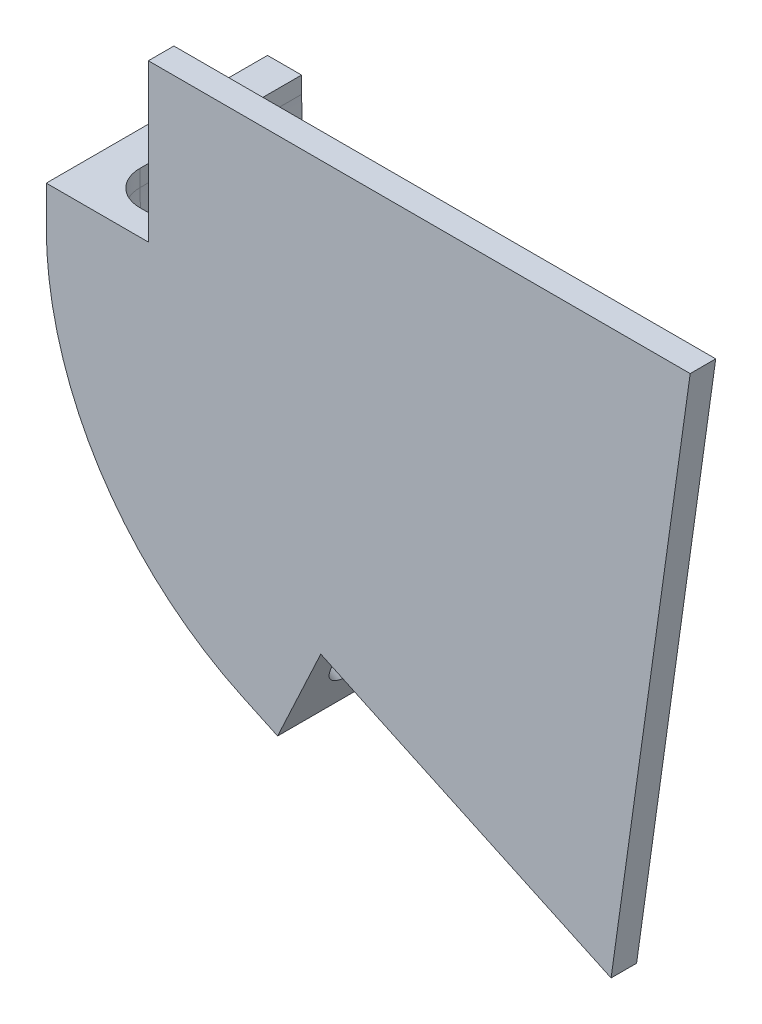
ISO-10303-21;
HEADER;
FILE_DESCRIPTION(('STEP AP214'),'2;1');
FILE_NAME('part.step','',(''),(''),'','','');
FILE_SCHEMA(('AUTOMOTIVE_DESIGN { 1 0 10303 214 1 1 1 1 }'));
ENDSEC;
DATA;
#1=APPLICATION_CONTEXT('core data for automotive mechanical design processes');
#2=APPLICATION_PROTOCOL_DEFINITION('international standard','automotive_design',2000,#1);
#3=PRODUCT_CONTEXT('',#1,'mechanical');
#4=PRODUCT('Part','Part','',(#3));
#5=PRODUCT_RELATED_PRODUCT_CATEGORY('part','',(#4));
#6=PRODUCT_DEFINITION_FORMATION('','',#4);
#7=PRODUCT_DEFINITION_CONTEXT('part definition',#1,'design');
#8=PRODUCT_DEFINITION('design','',#6,#7);
#9=PRODUCT_DEFINITION_SHAPE('','',#8);
#10=(LENGTH_UNIT() NAMED_UNIT(*) SI_UNIT(.MILLI.,.METRE.));
#11=(NAMED_UNIT(*) PLANE_ANGLE_UNIT() SI_UNIT($,.RADIAN.));
#12=(NAMED_UNIT(*) SI_UNIT($,.STERADIAN.) SOLID_ANGLE_UNIT());
#13=UNCERTAINTY_MEASURE_WITH_UNIT(LENGTH_MEASURE(1.E-05),#10,'distance_accuracy_value','');
#14=(GEOMETRIC_REPRESENTATION_CONTEXT(3) GLOBAL_UNCERTAINTY_ASSIGNED_CONTEXT((#13)) GLOBAL_UNIT_ASSIGNED_CONTEXT((#10,
#11,#12)) REPRESENTATION_CONTEXT('',''));
#15=CARTESIAN_POINT('',(0.,0.,0.));
#16=DIRECTION('',(0.,0.,1.));
#17=DIRECTION('',(1.,0.,0.));
#18=AXIS2_PLACEMENT_3D('',#15,#16,#17);
#19=CARTESIAN_POINT('',(-18.0763999587272,-9.66698227820091,24.5));
#20=DIRECTION('',(1.,0.,0.));
#21=DIRECTION('',(0.,1.,0.));
#22=AXIS2_PLACEMENT_3D('',#19,#20,#21);
#23=PLANE('',#22);
#24=DIRECTION('',(0.,-1.,0.));
#25=VECTOR('',#24,1.);
#26=CARTESIAN_POINT('',(-18.0763999587272,-9.66698227820091,26.));
#27=LINE('',#26,#25);
#28=CARTESIAN_POINT('',(-18.0763999587272,-4.26205433738103,26.));
#29=VERTEX_POINT('',#28);
#30=CARTESIAN_POINT('',(-18.0763999587272,-13.4894038430459,26.));
#31=VERTEX_POINT('',#30);
#32=EDGE_CURVE('E227',#29,#31,#27,.T.);
#33=ORIENTED_EDGE('',*,*,#32,.F.);
#34=DIRECTION('',(0.,0.,1.));
#35=VECTOR('',#34,1.);
#36=CARTESIAN_POINT('',(-18.0763999587272,-4.26205433738103,24.5));
#37=LINE('',#36,#35);
#38=CARTESIAN_POINT('',(-18.0763999587272,-4.26205433738103,24.5));
#39=VERTEX_POINT('',#38);
#40=EDGE_CURVE('E244',#39,#29,#37,.T.);
#41=ORIENTED_EDGE('',*,*,#40,.F.);
#42=DIRECTION('',(0.,-1.,0.));
#43=VECTOR('',#42,1.);
#44=CARTESIAN_POINT('',(-18.0763999587272,-4.26205433738103,24.5));
#45=LINE('',#44,#43);
#46=CARTESIAN_POINT('',(-18.0763999587272,-13.4894038430459,24.5));
#47=VERTEX_POINT('',#46);
#48=EDGE_CURVE('E228',#39,#47,#45,.T.);
#49=ORIENTED_EDGE('',*,*,#48,.T.);
#50=DIRECTION('',(0.,0.,-1.));
#51=VECTOR('',#50,1.);
#52=CARTESIAN_POINT('',(-18.0763999587272,-13.4894038430459,24.5));
#53=LINE('',#52,#51);
#54=EDGE_CURVE('E217',#31,#47,#53,.T.);
#55=ORIENTED_EDGE('',*,*,#54,.F.);
#56=EDGE_LOOP('',(#33,#41,#49,#55));
#57=FACE_BOUND('',#56,.T.);
#58=ADVANCED_FACE('F45',(#57),#23,.F.);
#59=CARTESIAN_POINT('',(-4.48178315317741,-31.0062562043114,24.5));
#60=DIRECTION('',(0.422618261740697,0.906307787036651,0.));
#61=DIRECTION('',(-0.906307787036651,0.422618261740697,0.));
#62=AXIS2_PLACEMENT_3D('',#59,#60,#61);
#63=PLANE('',#62);
#64=DIRECTION('',(0.906307787036651,-0.422618261740697,0.));
#65=VECTOR('',#64,1.);
#66=CARTESIAN_POINT('',(-4.48178315317741,-31.0062562043114,24.5));
#67=LINE('',#66,#65);
#68=CARTESIAN_POINT('',(-7.94607358273322,-29.3908310469364,24.5));
#69=VERTEX_POINT('',#68);
#70=CARTESIAN_POINT('',(9.11283365237236,-37.3455301304218,24.5));
#71=VERTEX_POINT('',#70);
#72=EDGE_CURVE('E232',#69,#71,#67,.T.);
#73=ORIENTED_EDGE('',*,*,#72,.T.);
#74=DIRECTION('',(0.,0.,1.));
#75=VECTOR('',#74,1.);
#76=CARTESIAN_POINT('',(9.11283365237236,-37.3455301304218,24.5));
#77=LINE('',#76,#75);
#78=CARTESIAN_POINT('',(9.11283365237236,-37.3455301304218,26.));
#79=VERTEX_POINT('',#78);
#80=EDGE_CURVE('E265',#71,#79,#77,.T.);
#81=ORIENTED_EDGE('',*,*,#80,.T.);
#82=DIRECTION('',(0.906307787036651,-0.422618261740697,0.));
#83=VECTOR('',#82,1.);
#84=CARTESIAN_POINT('',(-4.48178315317741,-31.0062562043114,26.));
#85=LINE('',#84,#83);
#86=CARTESIAN_POINT('',(-7.94607358273322,-29.3908310469364,26.));
#87=VERTEX_POINT('',#86);
#88=EDGE_CURVE('E248',#87,#79,#85,.T.);
#89=ORIENTED_EDGE('',*,*,#88,.F.);
#90=DIRECTION('',(0.,0.,1.));
#91=VECTOR('',#90,1.);
#92=CARTESIAN_POINT('',(-7.94607358273322,-29.3908310469364,24.5));
#93=LINE('',#92,#91);
#94=EDGE_CURVE('E223',#69,#87,#93,.T.);
#95=ORIENTED_EDGE('',*,*,#94,.F.);
#96=EDGE_LOOP('',(#73,#81,#89,#95));
#97=FACE_BOUND('',#96,.T.);
#98=ADVANCED_FACE('F357',(#97),#63,.F.);
#99=CARTESIAN_POINT('',(9.11283365237236,-37.3455301304218,24.5));
#100=DIRECTION('',(-0.990268068741571,0.139173100960062,0.));
#101=DIRECTION('',(-0.139173100960062,-0.990268068741571,0.));
#102=AXIS2_PLACEMENT_3D('',#99,#100,#101);
#103=PLANE('',#102);
#104=DIRECTION('',(0.139173100960062,0.990268068741571,0.));
#105=VECTOR('',#104,1.);
#106=CARTESIAN_POINT('',(9.11283365237236,-37.3455301304218,26.));
#107=LINE('',#106,#105);
#108=CARTESIAN_POINT('',(13.7624129551826,-4.26205433738103,26.));
#109=VERTEX_POINT('',#108);
#110=EDGE_CURVE('E252',#79,#109,#107,.T.);
#111=ORIENTED_EDGE('',*,*,#110,.F.);
#112=ORIENTED_EDGE('',*,*,#80,.F.);
#113=DIRECTION('',(0.139173100960062,0.990268068741571,0.));
#114=VECTOR('',#113,1.);
#115=CARTESIAN_POINT('',(9.11283365237236,-37.3455301304218,24.5));
#116=LINE('',#115,#114);
#117=CARTESIAN_POINT('',(13.7624129551826,-4.26205433738103,24.5));
#118=VERTEX_POINT('',#117);
#119=EDGE_CURVE('E237',#71,#118,#116,.T.);
#120=ORIENTED_EDGE('',*,*,#119,.T.);
#121=DIRECTION('',(0.,0.,1.));
#122=VECTOR('',#121,1.);
#123=CARTESIAN_POINT('',(13.7624129551826,-4.26205433738103,24.5));
#124=LINE('',#123,#122);
#125=EDGE_CURVE('E261',#118,#109,#124,.T.);
#126=ORIENTED_EDGE('',*,*,#125,.T.);
#127=EDGE_LOOP('',(#111,#112,#120,#126));
#128=FACE_BOUND('',#127,.T.);
#129=ADVANCED_FACE('F362',(#128),#103,.F.);
#130=CARTESIAN_POINT('',(-18.0763999587272,-4.26205433738103,24.5));
#131=DIRECTION('',(0.,-1.,0.));
#132=DIRECTION('',(1.,0.,0.));
#133=AXIS2_PLACEMENT_3D('',#130,#131,#132);
#134=PLANE('',#133);
#135=DIRECTION('',(-1.,0.,0.));
#136=VECTOR('',#135,1.);
#137=CARTESIAN_POINT('',(-18.0763999587272,-4.26205433738103,26.));
#138=LINE('',#137,#136);
#139=EDGE_CURVE('E233',#109,#29,#138,.T.);
#140=ORIENTED_EDGE('',*,*,#139,.F.);
#141=ORIENTED_EDGE('',*,*,#125,.F.);
#142=DIRECTION('',(-1.,0.,0.));
#143=VECTOR('',#142,1.);
#144=CARTESIAN_POINT('',(-18.0763999587272,-4.26205433738103,24.5));
#145=LINE('',#144,#143);
#146=EDGE_CURVE('E241',#118,#39,#145,.T.);
#147=ORIENTED_EDGE('',*,*,#146,.T.);
#148=ORIENTED_EDGE('',*,*,#40,.T.);
#149=EDGE_LOOP('',(#140,#141,#147,#148));
#150=FACE_BOUND('',#149,.T.);
#151=ADVANCED_FACE('F374',(#150),#134,.F.);
#152=CARTESIAN_POINT('',(0.,0.,24.5));
#153=DIRECTION('',(0.,0.,-1.));
#154=DIRECTION('',(1.,0.,0.));
#155=AXIS2_PLACEMENT_3D('',#152,#153,#154);
#156=PLANE('',#155);
#157=DIRECTION('',(-1.,0.,0.));
#158=VECTOR('',#157,1.);
#159=CARTESIAN_POINT('',(-17.0763999587272,-13.4894038430459,24.5));
#160=LINE('',#159,#158);
#161=CARTESIAN_POINT('',(-20.0763999587272,-13.4894038430459,24.5));
#162=VERTEX_POINT('',#161);
#163=EDGE_CURVE('E173',#47,#162,#160,.T.);
#164=ORIENTED_EDGE('',*,*,#163,.F.);
#165=ORIENTED_EDGE('',*,*,#48,.F.);
#166=ORIENTED_EDGE('',*,*,#146,.F.);
#167=ORIENTED_EDGE('',*,*,#119,.F.);
#168=ORIENTED_EDGE('',*,*,#72,.F.);
#169=DIRECTION('',(0.422618261740697,0.906307787036651,0.));
#170=VECTOR('',#169,1.);
#171=CARTESIAN_POINT('',(-9.63654662969602,-33.016062195083,24.5));
#172=LINE('',#171,#170);
#173=CARTESIAN_POINT('',(-8.79131010621462,-31.2034466210097,24.5));
#174=VERTEX_POINT('',#173);
#175=EDGE_CURVE('E321',#174,#69,#172,.T.);
#176=ORIENTED_EDGE('',*,*,#175,.F.);
#177=DIRECTION('',(0.906307787036651,-0.422618261740697,0.));
#178=VECTOR('',#177,1.);
#179=CARTESIAN_POINT('',(-13.5217958936059,-28.9975848715558,24.5));
#180=LINE('',#179,#178);
#181=CARTESIAN_POINT('',(-9.68352867005972,-30.7873982719407,24.5));
#182=VERTEX_POINT('',#181);
#183=EDGE_CURVE('E295',#182,#174,#180,.T.);
#184=ORIENTED_EDGE('',*,*,#183,.F.);
#185=CARTESIAN_POINT('',(-2.07639995872717,-14.473858105281,24.5));
#186=DIRECTION('',(0.,0.,1.));
#187=DIRECTION('',(1.,0.,0.));
#188=AXIS2_PLACEMENT_3D('',#185,#186,#187);
#189=CIRCLE('',#188,18.);
#190=CARTESIAN_POINT('',(-20.0763999587272,-14.473858105281,24.5));
#191=VERTEX_POINT('',#190);
#192=EDGE_CURVE('E292',#191,#182,#189,.T.);
#193=ORIENTED_EDGE('',*,*,#192,.F.);
#194=DIRECTION('',(0.,-1.,0.));
#195=VECTOR('',#194,1.);
#196=CARTESIAN_POINT('',(-20.0763999587272,0.,24.5));
#197=LINE('',#196,#195);
#198=EDGE_CURVE('E299',#162,#191,#197,.T.);
#199=ORIENTED_EDGE('',*,*,#198,.F.);
#200=EDGE_LOOP('',(#164,#165,#166,#167,#168,#176,#184,#193,#199));
#201=FACE_BOUND('',#200,.T.);
#202=ADVANCED_FACE('F377',(#201),#156,.T.);
#203=CARTESIAN_POINT('',(0.,0.,26.));
#204=DIRECTION('',(0.,0.,-1.));
#205=DIRECTION('',(1.,0.,0.));
#206=AXIS2_PLACEMENT_3D('',#203,#204,#205);
#207=PLANE('',#206);
#208=DIRECTION('',(-0.906307787036651,0.422618261740697,0.));
#209=VECTOR('',#208,1.);
#210=CARTESIAN_POINT('',(-10.4817831531774,-34.8286777691563,26.));
#211=LINE('',#210,#209);
#212=CARTESIAN_POINT('',(-10.4817831531774,-34.8286777691563,26.));
#213=VERTEX_POINT('',#212);
#214=CARTESIAN_POINT('',(-12.5287651935411,-33.874154367629,26.));
#215=VERTEX_POINT('',#214);
#216=EDGE_CURVE('E207',#213,#215,#211,.T.);
#217=ORIENTED_EDGE('',*,*,#216,.F.);
#218=DIRECTION('',(-0.422618261740697,-0.906307787036651,0.));
#219=VECTOR('',#218,1.);
#220=CARTESIAN_POINT('',(-10.4817831531774,-34.8286777691563,26.));
#221=LINE('',#220,#219);
#222=EDGE_CURVE('E181',#87,#213,#221,.T.);
#223=ORIENTED_EDGE('',*,*,#222,.F.);
#224=ORIENTED_EDGE('',*,*,#88,.T.);
#225=ORIENTED_EDGE('',*,*,#110,.T.);
#226=ORIENTED_EDGE('',*,*,#139,.T.);
#227=ORIENTED_EDGE('',*,*,#32,.T.);
#228=DIRECTION('',(1.,0.,0.));
#229=VECTOR('',#228,1.);
#230=CARTESIAN_POINT('',(-24.0763999587272,-13.4894038430459,26.));
#231=LINE('',#230,#229);
#232=CARTESIAN_POINT('',(-24.0763999587272,-13.4894038430459,26.));
#233=VERTEX_POINT('',#232);
#234=EDGE_CURVE('E189',#233,#31,#231,.T.);
#235=ORIENTED_EDGE('',*,*,#234,.F.);
#236=DIRECTION('',(0.,1.,0.));
#237=VECTOR('',#236,1.);
#238=CARTESIAN_POINT('',(-24.0763999587272,-28.4894038430459,26.));
#239=LINE('',#238,#237);
#240=CARTESIAN_POINT('',(-24.0763999587272,-15.747998626896,26.));
#241=VERTEX_POINT('',#240);
#242=EDGE_CURVE('E195',#241,#233,#239,.T.);
#243=ORIENTED_EDGE('',*,*,#242,.F.);
#244=CARTESIAN_POINT('',(-4.07639995872718,-15.747998626896,26.));
#245=DIRECTION('',(0.,0.,1.));
#246=DIRECTION('',(1.,0.,0.));
#247=AXIS2_PLACEMENT_3D('',#244,#245,#246);
#248=CIRCLE('',#247,20.);
#249=EDGE_CURVE('E279',#215,#241,#248,.F.);
#250=ORIENTED_EDGE('',*,*,#249,.F.);
#251=EDGE_LOOP('',(#217,#223,#224,#225,#226,#227,#235,#243,#250));
#252=FACE_BOUND('',#251,.T.);
#253=ADVANCED_FACE('F370',(#252),#207,.F.);
#254=CARTESIAN_POINT('',(-10.4817831531774,-34.8286777691563,13.));
#255=DIRECTION('',(0.906307787036651,-0.422618261740697,0.));
#256=DIRECTION('',(0.422618261740697,0.906307787036651,0.));
#257=AXIS2_PLACEMENT_3D('',#254,#255,#256);
#258=PLANE('',#257);
#259=ORIENTED_EDGE('',*,*,#175,.T.);
#260=ORIENTED_EDGE('',*,*,#94,.T.);
#261=ORIENTED_EDGE('',*,*,#222,.T.);
#262=DIRECTION('',(0.,0.,1.));
#263=VECTOR('',#262,1.);
#264=CARTESIAN_POINT('',(-10.4817831531774,-34.8286777691563,13.));
#265=LINE('',#264,#263);
#266=CARTESIAN_POINT('',(-10.4817831531774,-34.8286777691563,13.));
#267=VERTEX_POINT('',#266);
#268=EDGE_CURVE('E186',#267,#213,#265,.T.);
#269=ORIENTED_EDGE('',*,*,#268,.F.);
#270=DIRECTION('',(-0.422618261740697,-0.906307787036651,0.));
#271=VECTOR('',#270,1.);
#272=CARTESIAN_POINT('',(-10.4817831531774,-34.8286777691563,13.));
#273=LINE('',#272,#271);
#274=CARTESIAN_POINT('',(-9.63654662969602,-33.016062195083,13.));
#275=VERTEX_POINT('',#274);
#276=EDGE_CURVE('E167',#275,#267,#273,.T.);
#277=ORIENTED_EDGE('',*,*,#276,.F.);
#278=DIRECTION('',(0.,0.,-1.));
#279=VECTOR('',#278,1.);
#280=CARTESIAN_POINT('',(-9.63654662969602,-33.016062195083,24.5));
#281=LINE('',#280,#279);
#282=CARTESIAN_POINT('',(-9.63654662969602,-33.016062195083,22.5));
#283=VERTEX_POINT('',#282);
#284=EDGE_CURVE('E177',#283,#275,#281,.T.);
#285=ORIENTED_EDGE('',*,*,#284,.F.);
#286=CARTESIAN_POINT('',(-8.79131010621462,-31.2034466210097,22.5));
#287=DIRECTION('',(-0.906307787036651,0.422618261740697,0.));
#288=DIRECTION('',(0.422618261740697,0.906307787036651,0.));
#289=AXIS2_PLACEMENT_3D('',#286,#287,#288);
#290=CIRCLE('',#289,2.);
#291=EDGE_CURVE('E11',#174,#283,#290,.F.);
#292=ORIENTED_EDGE('',*,*,#291,.F.);
#293=EDGE_LOOP('',(#259,#260,#261,#269,#277,#285,#292));
#294=FACE_BOUND('',#293,.T.);
#295=ADVANCED_FACE('F184',(#294),#258,.T.);
#296=CARTESIAN_POINT('',(-24.0763999587272,-13.4894038430459,13.));
#297=DIRECTION('',(0.,1.,0.));
#298=DIRECTION('',(0.,0.,-1.));
#299=AXIS2_PLACEMENT_3D('',#296,#297,#298);
#300=PLANE('',#299);
#301=DIRECTION('',(0.,0.,-1.));
#302=VECTOR('',#301,1.);
#303=CARTESIAN_POINT('',(-22.0763999587272,-13.4894038430459,24.5));
#304=LINE('',#303,#302);
#305=CARTESIAN_POINT('',(-22.0763999587272,-13.4894038430459,22.5));
#306=VERTEX_POINT('',#305);
#307=CARTESIAN_POINT('',(-22.0763999587272,-13.4894038430459,13.));
#308=VERTEX_POINT('',#307);
#309=EDGE_CURVE('E182',#306,#308,#304,.T.);
#310=ORIENTED_EDGE('',*,*,#309,.T.);
#311=DIRECTION('',(1.,0.,0.));
#312=VECTOR('',#311,1.);
#313=CARTESIAN_POINT('',(-24.0763999587272,-13.4894038430459,13.));
#314=LINE('',#313,#312);
#315=CARTESIAN_POINT('',(-24.0763999587272,-13.4894038430459,13.));
#316=VERTEX_POINT('',#315);
#317=EDGE_CURVE('E201',#316,#308,#314,.T.);
#318=ORIENTED_EDGE('',*,*,#317,.F.);
#319=DIRECTION('',(0.,0.,1.));
#320=VECTOR('',#319,1.);
#321=CARTESIAN_POINT('',(-24.0763999587272,-13.4894038430459,13.));
#322=LINE('',#321,#320);
#323=EDGE_CURVE('E214',#316,#233,#322,.T.);
#324=ORIENTED_EDGE('',*,*,#323,.T.);
#325=ORIENTED_EDGE('',*,*,#234,.T.);
#326=ORIENTED_EDGE('',*,*,#54,.T.);
#327=ORIENTED_EDGE('',*,*,#163,.T.);
#328=CARTESIAN_POINT('',(-20.0763999587272,-13.4894038430459,22.5));
#329=DIRECTION('',(0.,-1.,0.));
#330=DIRECTION('',(0.,0.,-1.));
#331=AXIS2_PLACEMENT_3D('',#328,#329,#330);
#332=CIRCLE('',#331,2.);
#333=EDGE_CURVE('E60',#306,#162,#332,.F.);
#334=ORIENTED_EDGE('',*,*,#333,.F.);
#335=EDGE_LOOP('',(#310,#318,#324,#325,#326,#327,#334));
#336=FACE_BOUND('',#335,.T.);
#337=ADVANCED_FACE('F383',(#336),#300,.T.);
#338=CARTESIAN_POINT('',(-24.0763999587272,-28.4894038430459,13.));
#339=DIRECTION('',(-1.,0.,0.));
#340=DIRECTION('',(0.,0.,-1.));
#341=AXIS2_PLACEMENT_3D('',#338,#339,#340);
#342=PLANE('',#341);
#343=ORIENTED_EDGE('',*,*,#242,.T.);
#344=ORIENTED_EDGE('',*,*,#323,.F.);
#345=DIRECTION('',(0.,1.,0.));
#346=VECTOR('',#345,1.);
#347=CARTESIAN_POINT('',(-24.0763999587272,-28.4894038430459,13.));
#348=LINE('',#347,#346);
#349=CARTESIAN_POINT('',(-24.0763999587272,-15.747998626896,13.));
#350=VERTEX_POINT('',#349);
#351=EDGE_CURVE('E193',#350,#316,#348,.T.);
#352=ORIENTED_EDGE('',*,*,#351,.F.);
#353=DIRECTION('',(0.,0.,1.));
#354=VECTOR('',#353,1.);
#355=CARTESIAN_POINT('',(-24.0763999587272,-15.747998626896,13.));
#356=LINE('',#355,#354);
#357=EDGE_CURVE('E283',#241,#350,#356,.F.);
#358=ORIENTED_EDGE('',*,*,#357,.F.);
#359=EDGE_LOOP('',(#343,#344,#352,#358));
#360=FACE_BOUND('',#359,.T.);
#361=ADVANCED_FACE('F388',(#360),#342,.T.);
#362=CARTESIAN_POINT('',(-10.4817831531774,-34.8286777691563,13.));
#363=DIRECTION('',(-0.422618261740697,-0.906307787036651,0.));
#364=DIRECTION('',(0.906307787036651,-0.422618261740697,0.));
#365=AXIS2_PLACEMENT_3D('',#362,#363,#364);
#366=PLANE('',#365);
#367=DIRECTION('',(-0.906307787036651,0.422618261740697,0.));
#368=VECTOR('',#367,1.);
#369=CARTESIAN_POINT('',(-10.4817831531774,-34.8286777691563,13.));
#370=LINE('',#369,#368);
#371=CARTESIAN_POINT('',(-12.5287651935411,-33.874154367629,13.));
#372=VERTEX_POINT('',#371);
#373=EDGE_CURVE('E188',#267,#372,#370,.T.);
#374=ORIENTED_EDGE('',*,*,#373,.F.);
#375=ORIENTED_EDGE('',*,*,#268,.T.);
#376=ORIENTED_EDGE('',*,*,#216,.T.);
#377=DIRECTION('',(0.,0.,1.));
#378=VECTOR('',#377,1.);
#379=CARTESIAN_POINT('',(-12.5287651935411,-33.874154367629,13.));
#380=LINE('',#379,#378);
#381=EDGE_CURVE('E276',#372,#215,#380,.T.);
#382=ORIENTED_EDGE('',*,*,#381,.F.);
#383=EDGE_LOOP('',(#374,#375,#376,#382));
#384=FACE_BOUND('',#383,.T.);
#385=ADVANCED_FACE('F393',(#384),#366,.T.);
#386=CARTESIAN_POINT('',(0.,0.,13.));
#387=DIRECTION('',(0.,0.,-1.));
#388=DIRECTION('',(1.,0.,0.));
#389=AXIS2_PLACEMENT_3D('',#386,#387,#388);
#390=PLANE('',#389);
#391=ORIENTED_EDGE('',*,*,#351,.T.);
#392=ORIENTED_EDGE('',*,*,#317,.T.);
#393=DIRECTION('',(0.,-1.,0.));
#394=VECTOR('',#393,1.);
#395=CARTESIAN_POINT('',(-22.0763999587272,-13.4894038430459,13.));
#396=LINE('',#395,#394);
#397=CARTESIAN_POINT('',(-22.0763999587272,-14.473858105281,13.));
#398=VERTEX_POINT('',#397);
#399=EDGE_CURVE('E174',#308,#398,#396,.T.);
#400=ORIENTED_EDGE('',*,*,#399,.T.);
#401=CARTESIAN_POINT('',(-2.07639995872717,-14.473858105281,13.));
#402=DIRECTION('',(0.,0.,1.));
#403=DIRECTION('',(1.,0.,0.));
#404=AXIS2_PLACEMENT_3D('',#401,#402,#403);
#405=CIRCLE('',#404,20.);
#406=CARTESIAN_POINT('',(-10.5287651935411,-32.600013846014,13.));
#407=VERTEX_POINT('',#406);
#408=EDGE_CURVE('E171',#407,#398,#405,.F.);
#409=ORIENTED_EDGE('',*,*,#408,.F.);
#410=DIRECTION('',(0.906307787036651,-0.422618261740697,0.));
#411=VECTOR('',#410,1.);
#412=CARTESIAN_POINT('',(-22.0763999587272,-27.2152633214309,13.));
#413=LINE('',#412,#411);
#414=EDGE_CURVE('E163',#407,#275,#413,.T.);
#415=ORIENTED_EDGE('',*,*,#414,.T.);
#416=ORIENTED_EDGE('',*,*,#276,.T.);
#417=ORIENTED_EDGE('',*,*,#373,.T.);
#418=CARTESIAN_POINT('',(-4.07639995872718,-15.747998626896,13.));
#419=DIRECTION('',(0.,0.,1.));
#420=DIRECTION('',(1.,0.,0.));
#421=AXIS2_PLACEMENT_3D('',#418,#419,#420);
#422=CIRCLE('',#421,20.);
#423=EDGE_CURVE('E289',#350,#372,#422,.T.);
#424=ORIENTED_EDGE('',*,*,#423,.F.);
#425=EDGE_LOOP('',(#391,#392,#400,#409,#415,#416,#417,#424));
#426=FACE_BOUND('',#425,.T.);
#427=ADVANCED_FACE('F164',(#426),#390,.T.);
#428=CARTESIAN_POINT('',(-22.0763999587272,-27.2152633214309,24.5));
#429=DIRECTION('',(-0.422618261740697,-0.906307787036651,0.));
#430=DIRECTION('',(0.906307787036651,-0.422618261740697,0.));
#431=AXIS2_PLACEMENT_3D('',#428,#429,#430);
#432=PLANE('',#431);
#433=ORIENTED_EDGE('',*,*,#284,.T.);
#434=ORIENTED_EDGE('',*,*,#414,.F.);
#435=DIRECTION('',(0.,0.,-1.));
#436=VECTOR('',#435,1.);
#437=CARTESIAN_POINT('',(-10.5287651935411,-32.600013846014,13.));
#438=LINE('',#437,#436);
#439=CARTESIAN_POINT('',(-10.5287651935411,-32.600013846014,22.5));
#440=VERTEX_POINT('',#439);
#441=EDGE_CURVE('E269',#440,#407,#438,.T.);
#442=ORIENTED_EDGE('',*,*,#441,.F.);
#443=DIRECTION('',(0.906307787036651,-0.422618261740697,0.));
#444=VECTOR('',#443,1.);
#445=CARTESIAN_POINT('',(-22.0763999587272,-27.2152633214309,22.5));
#446=LINE('',#445,#444);
#447=EDGE_CURVE('E68',#283,#440,#446,.F.);
#448=ORIENTED_EDGE('',*,*,#447,.F.);
#449=EDGE_LOOP('',(#433,#434,#442,#448));
#450=FACE_BOUND('',#449,.T.);
#451=ADVANCED_FACE('F178',(#450),#432,.F.);
#452=CARTESIAN_POINT('',(-22.0763999587272,-13.4894038430459,24.5));
#453=DIRECTION('',(-1.,0.,0.));
#454=DIRECTION('',(0.,-1.,0.));
#455=AXIS2_PLACEMENT_3D('',#452,#453,#454);
#456=PLANE('',#455);
#457=DIRECTION('',(0.,0.,-1.));
#458=VECTOR('',#457,1.);
#459=CARTESIAN_POINT('',(-22.0763999587272,-14.473858105281,24.5));
#460=LINE('',#459,#458);
#461=CARTESIAN_POINT('',(-22.0763999587272,-14.473858105281,22.5));
#462=VERTEX_POINT('',#461);
#463=EDGE_CURVE('E272',#398,#462,#460,.F.);
#464=ORIENTED_EDGE('',*,*,#463,.F.);
#465=ORIENTED_EDGE('',*,*,#399,.F.);
#466=ORIENTED_EDGE('',*,*,#309,.F.);
#467=DIRECTION('',(0.,-1.,0.));
#468=VECTOR('',#467,1.);
#469=CARTESIAN_POINT('',(-22.0763999587272,-13.4894038430459,22.5));
#470=LINE('',#469,#468);
#471=EDGE_CURVE('E303',#462,#306,#470,.F.);
#472=ORIENTED_EDGE('',*,*,#471,.F.);
#473=EDGE_LOOP('',(#464,#465,#466,#472));
#474=FACE_BOUND('',#473,.T.);
#475=ADVANCED_FACE('F341',(#474),#456,.F.);
#476=CARTESIAN_POINT('',(-2.07639995872717,-14.473858105281,24.5));
#477=DIRECTION('',(0.,0.,1.));
#478=DIRECTION('',(-1.,0.,0.));
#479=AXIS2_PLACEMENT_3D('',#476,#477,#478);
#480=CYLINDRICAL_SURFACE('',#479,20.);
#481=CARTESIAN_POINT('',(-20.7678153372847,-21.5894038430459,17.));
#482=CARTESIAN_POINT('',(-20.7678141770929,-21.5894083477923,17.0852523471951));
#483=CARTESIAN_POINT('',(-20.7652141194363,-21.59624850969,17.1705754490834));
#484=CARTESIAN_POINT('',(-20.7548579455274,-21.623362191458,17.3388108975141));
#485=CARTESIAN_POINT('',(-20.7470949158574,-21.6436537231105,17.421719855841));
#486=CARTESIAN_POINT('',(-20.7265847458111,-21.6968361999463,17.5825834846501));
#487=CARTESIAN_POINT('',(-20.7138457990636,-21.72970643053,17.660546056058));
#488=CARTESIAN_POINT('',(-20.6836478983129,-21.806799491477,17.8095970256527));
#489=CARTESIAN_POINT('',(-20.666189888356,-21.8510200511236,17.8806867948825));
#490=CARTESIAN_POINT('',(-20.6264500346652,-21.950392178167,18.0158986330322));
#491=CARTESIAN_POINT('',(-20.604066421016,-22.0057718922472,18.0798226931327));
#492=CARTESIAN_POINT('',(-20.5551832526062,-22.12491755973,18.1974485705252));
#493=CARTESIAN_POINT('',(-20.5286826647529,-22.1886856174438,18.2511478145055));
#494=CARTESIAN_POINT('',(-20.4703421265083,-22.3268092162932,18.350407668222));
#495=CARTESIAN_POINT('',(-20.438273641063,-22.4015752224839,18.395261831182));
#496=CARTESIAN_POINT('',(-20.3707752476716,-22.5561194814951,18.47186877227));
#497=CARTESIAN_POINT('',(-20.3353442092935,-22.6358994168454,18.5036171251255));
#498=CARTESIAN_POINT('',(-20.2588841184759,-22.8049167090655,18.555830268494));
#499=CARTESIAN_POINT('',(-20.2176340311221,-22.8943982925161,18.5751805019383));
#500=CARTESIAN_POINT('',(-20.1330141468655,-23.0743572904798,18.5984384542656));
#501=CARTESIAN_POINT('',(-20.0896435513185,-23.1648350700927,18.6023403087775));
#502=CARTESIAN_POINT('',(-19.9983729495711,-23.3516109553059,18.5947058329222));
#503=CARTESIAN_POINT('',(-19.9503825357,-23.4478162291048,18.5819486795888));
#504=CARTESIAN_POINT('',(-19.8544415174331,-23.6364149454596,18.5393295372437));
#505=CARTESIAN_POINT('',(-19.8064909350409,-23.7288069283638,18.5094610622775));
#506=CARTESIAN_POINT('',(-19.7104182931736,-23.9106129399078,18.4317749424645));
#507=CARTESIAN_POINT('',(-19.6623530670658,-23.999797493663,18.3833457013644));
#508=CARTESIAN_POINT('',(-19.5698104265901,-24.1686952644619,18.2693938907422));
#509=CARTESIAN_POINT('',(-19.5253331011461,-24.2484082467814,18.203870897732));
#510=CARTESIAN_POINT('',(-19.4442774994102,-24.3916848883631,18.0603316212307));
#511=CARTESIAN_POINT('',(-19.4074222198671,-24.4558408166981,17.9830676632934));
#512=CARTESIAN_POINT('',(-19.3413935255095,-24.5696165217967,17.8156112120375));
#513=CARTESIAN_POINT('',(-19.3122105588802,-24.6192543818979,17.7254350123366));
#514=CARTESIAN_POINT('',(-19.2670934534144,-24.6954903476004,17.5475374840823));
#515=CARTESIAN_POINT('',(-19.2499181312615,-24.7242662838447,17.4610665127999));
#516=CARTESIAN_POINT('',(-19.2244785219504,-24.7667699472041,17.2832677814028));
#517=CARTESIAN_POINT('',(-19.2162042384907,-24.7805145555239,17.191945590701));
#518=CARTESIAN_POINT('',(-19.2097193110549,-24.7912895276127,17.0199837975297));
#519=CARTESIAN_POINT('',(-19.2103375295126,-24.7902649431104,16.9395032725477));
#520=CARTESIAN_POINT('',(-19.2187832857855,-24.7762248914562,16.779992677067));
#521=CARTESIAN_POINT('',(-19.2266095178635,-24.7632115960684,16.7009623465091));
#522=CARTESIAN_POINT('',(-19.2485903824013,-24.7264826241785,16.5491103681642));
#523=CARTESIAN_POINT('',(-19.2625350561147,-24.703121796626,16.4761710651915));
#524=CARTESIAN_POINT('',(-19.2959116533199,-24.6468361738449,16.3354409554868));
#525=CARTESIAN_POINT('',(-19.3153447648437,-24.613909307899,16.2676512674808));
#526=CARTESIAN_POINT('',(-19.3604110863252,-24.5369136643781,16.1336109930615));
#527=CARTESIAN_POINT('',(-19.386399164388,-24.4921960202643,16.0678542140266));
#528=CARTESIAN_POINT('',(-19.4425109172062,-24.3946120423566,15.9447016689132));
#529=CARTESIAN_POINT('',(-19.4726365101564,-24.3417419275893,15.8873098064842));
#530=CARTESIAN_POINT('',(-19.5400666255967,-24.2219681296758,15.7746779618828));
#531=CARTESIAN_POINT('',(-19.5777955040344,-24.154133690797,15.7206818792586));
#532=CARTESIAN_POINT('',(-19.6558142267232,-24.0117193402881,15.6247995309066));
#533=CARTESIAN_POINT('',(-19.6961054013398,-23.9371359158881,15.5829196196573));
#534=CARTESIAN_POINT('',(-19.7830358504023,-23.7735681916658,15.5074143846683));
#535=CARTESIAN_POINT('',(-19.8298538364225,-23.6839328321647,15.475398352886));
#536=CARTESIAN_POINT('',(-19.9237938332917,-23.500549520692,15.4276857076523));
#537=CARTESIAN_POINT('',(-19.9709159587216,-23.4067999310227,15.4119956554157));
#538=CARTESIAN_POINT('',(-20.0667995153714,-23.2121603978326,15.3970241543568));
#539=CARTESIAN_POINT('',(-20.1155042765204,-23.1111652379061,15.3987142594081));
#540=CARTESIAN_POINT('',(-20.2103992174098,-22.9101146793263,15.4213212918082));
#541=CARTESIAN_POINT('',(-20.2565894966657,-22.8100592436115,15.4422374576612));
#542=CARTESIAN_POINT('',(-20.3439357146066,-22.6168356114382,15.5026243190099));
#543=CARTESIAN_POINT('',(-20.3851932155633,-22.5235548097872,15.5415841306772));
#544=CARTESIAN_POINT('',(-20.4628735725575,-22.344506538397,15.6374859658528));
#545=CARTESIAN_POINT('',(-20.4992990870436,-22.2587349461692,15.6944180426675));
#546=CARTESIAN_POINT('',(-20.563551822824,-22.1048231108972,15.8198554024148));
#547=CARTESIAN_POINT('',(-20.5918339627742,-22.0358210464537,15.887069129571));
#548=CARTESIAN_POINT('',(-20.6426486729994,-21.9101886262859,16.0341105714891));
#549=CARTESIAN_POINT('',(-20.6651828563363,-21.8535548002783,16.1139347371501));
#550=CARTESIAN_POINT('',(-20.70224349057,-21.7594809550254,16.2765398773112));
#551=CARTESIAN_POINT('',(-20.717285542508,-21.72082378857,16.3585016345845));
#552=CARTESIAN_POINT('',(-20.7416659202701,-21.6577987334115,16.5284444220956));
#553=CARTESIAN_POINT('',(-20.7510148250266,-21.6334043451857,16.6164139482484));
#554=CARTESIAN_POINT('',(-20.7608771051242,-21.6076085981892,16.7543201617397));
#555=CARTESIAN_POINT('',(-20.7634764590345,-21.600792619934,16.8031620257066));
#556=CARTESIAN_POINT('',(-20.7669458918636,-21.591688988438,16.9013280311701));
#557=CARTESIAN_POINT('',(-20.7678160088551,-21.5894012354989,16.9506521620244));
#558=CARTESIAN_POINT('',(-20.7678153372847,-21.5894038430459,17.));
#559=B_SPLINE_CURVE_WITH_KNOTS('',3,(#481,#482,#483,#484,#485,#486,#487,#488,#489,#490,#491,
#492,#493,#494,#495,#496,#497,#498,#499,#500,#501,#502,#503,#504,#505,#506,#507,#508,#509,#510,
#511,#512,#513,#514,#515,#516,#517,#518,#519,#520,#521,#522,#523,#524,#525,#526,#527,#528,#529,
#530,#531,#532,#533,#534,#535,#536,#537,#538,#539,#540,#541,#542,#543,#544,#545,#546,#547,#548,
#549,#550,#551,#552,#553,#554,#555,#556,#557,#558),.UNSPECIFIED.,.T.,.F.,(4,2,2,2,2,2,2,2,2,2,2,
2,2,2,2,2,2,2,2,2,2,2,2,2,2,2,2,2,2,2,2,2,2,2,2,2,2,2,4),(0.,0.255570349506441,
0.511483608403567,0.766977230467737,1.02241977894026,1.28374112914034,1.54512816023409,
1.82264039760018,2.10024626250512,2.40020774729306,2.70028308978061,3.0236316311414,
3.34710281720143,3.68230368441976,4.0175128568391,4.33660197015887,4.65529192484022,
4.93186751804503,5.20813217803132,5.44838813223272,5.68860057244064,5.92114605900592,
6.15374192120056,6.40372393387764,6.65382223449762,6.9363487371554,7.21902314688986,
7.53585999843052,7.85282413377038,8.18759876283927,8.522360132901,8.84817372634152,
9.17380731447936,9.47336921617181,9.77284695841974,10.0470297151429,10.3207014218929,
10.4686401273802,10.6165755756553),.UNSPECIFIED.);
#560=CARTESIAN_POINT('',(-20.7678153372847,-21.5894038430459,17.));
#561=VERTEX_POINT('',#560);
#562=EDGE_CURVE('E315',#561,#561,#559,.T.);
#563=ORIENTED_EDGE('',*,*,#562,.F.);
#564=EDGE_LOOP('',(#563));
#565=FACE_BOUND('',#564,.T.);
#566=ORIENTED_EDGE('',*,*,#441,.T.);
#567=ORIENTED_EDGE('',*,*,#408,.T.);
#568=ORIENTED_EDGE('',*,*,#463,.T.);
#569=CARTESIAN_POINT('',(-2.07639995872717,-14.473858105281,22.5));
#570=DIRECTION('',(0.,0.,1.));
#571=DIRECTION('',(1.,0.,0.));
#572=AXIS2_PLACEMENT_3D('',#569,#570,#571);
#573=CIRCLE('',#572,20.);
#574=EDGE_CURVE('E308',#440,#462,#573,.F.);
#575=ORIENTED_EDGE('',*,*,#574,.F.);
#576=EDGE_LOOP('',(#566,#567,#568,#575));
#577=FACE_BOUND('',#576,.T.);
#578=ADVANCED_FACE('F336',(#565,#577),#480,.F.);
#579=CARTESIAN_POINT('',(-4.07639995872718,-15.747998626896,13.));
#580=DIRECTION('',(0.,0.,1.));
#581=DIRECTION('',(-1.,0.,0.));
#582=AXIS2_PLACEMENT_3D('',#579,#580,#581);
#583=CYLINDRICAL_SURFACE('',#582,20.);
#584=CARTESIAN_POINT('',(-23.2043372521401,-21.5894038430459,17.));
#585=CARTESIAN_POINT('',(-23.2043364933687,-21.5894081091698,17.0867479575165));
#586=CARTESIAN_POINT('',(-23.2021784156155,-21.5964875917499,17.1735614207073));
#587=CARTESIAN_POINT('',(-23.1935661572666,-21.6245761505456,17.3447562612119));
#588=CARTESIAN_POINT('',(-23.1871066833357,-21.6456023896352,17.4291345080775));
#589=CARTESIAN_POINT('',(-23.1699822975871,-21.7008082396105,17.5929066397781));
#590=CARTESIAN_POINT('',(-23.1593224331362,-21.7349720626378,17.6723063747578));
#591=CARTESIAN_POINT('',(-23.1339490187036,-21.8152539570409,17.8240644868848));
#592=CARTESIAN_POINT('',(-23.1192363241608,-21.861369505621,17.896424345596));
#593=CARTESIAN_POINT('',(-23.0857238277731,-21.9647981391643,18.0333503738709));
#594=CARTESIAN_POINT('',(-23.0668655098093,-22.0222702104882,18.0977819339431));
#595=CARTESIAN_POINT('',(-23.02550810624,-22.1460886059721,18.2160710856617));
#596=CARTESIAN_POINT('',(-23.0030083453464,-22.2124365757285,18.2699267119438));
#597=CARTESIAN_POINT('',(-22.9537631823705,-22.3548933913646,18.3679816670927));
#598=CARTESIAN_POINT('',(-22.9268808455569,-22.4312921338398,18.411690522651));
#599=CARTESIAN_POINT('',(-22.8701248111511,-22.5892670079657,18.4857498813915));
#600=CARTESIAN_POINT('',(-22.8402503676853,-22.6708444286944,18.5160970435413));
#601=CARTESIAN_POINT('',(-22.7763623002048,-22.8416701550543,18.5644158709709));
#602=CARTESIAN_POINT('',(-22.7422102186508,-22.9310915297882,18.5815922603953));
#603=CARTESIAN_POINT('',(-22.6720459487924,-23.1108288001018,18.6006250346999));
#604=CARTESIAN_POINT('',(-22.6360332166178,-23.201144950919,18.6024769144234));
#605=CARTESIAN_POINT('',(-22.560982503348,-23.3854488447606,18.5907737814644));
#606=CARTESIAN_POINT('',(-22.5218880276294,-23.4793590717137,18.5763504327433));
#607=CARTESIAN_POINT('',(-22.4437474509458,-23.6632077088405,18.5311681992648));
#608=CARTESIAN_POINT('',(-22.404701366153,-23.7531450246921,18.5004048437363));
#609=CARTESIAN_POINT('',(-22.3269241547002,-23.928942666425,18.4221740510834));
#610=CARTESIAN_POINT('',(-22.2882283732211,-24.0146333579879,18.3742882315838));
#611=CARTESIAN_POINT('',(-22.2137933984835,-24.1766946978617,18.2629015434636));
#612=CARTESIAN_POINT('',(-22.1780541241031,-24.2530656019199,18.199401103473));
#613=CARTESIAN_POINT('',(-22.1124702762086,-24.3912515639449,18.0605721568381));
#614=CARTESIAN_POINT('',(-22.082462474745,-24.4534844069219,17.9857387591091));
#615=CARTESIAN_POINT('',(-22.028571116023,-24.5640832982669,17.8244948144756));
#616=CARTESIAN_POINT('',(-22.0046828616861,-24.6124599853609,17.7380932248097));
#617=CARTESIAN_POINT('',(-21.9666200399447,-24.6890100241393,17.5650316752516));
#618=CARTESIAN_POINT('',(-21.9517343754797,-24.7186743684318,17.4791886566665));
#619=CARTESIAN_POINT('',(-21.9293663995845,-24.7631094376449,17.3028210780974));
#620=CARTESIAN_POINT('',(-21.9218784122164,-24.7778915812413,17.2123001634799));
#621=CARTESIAN_POINT('',(-21.9151978696373,-24.7910805904597,17.0385496990487));
#622=CARTESIAN_POINT('',(-21.9152784718001,-24.7909222446471,16.9554536698788));
#623=CARTESIAN_POINT('',(-21.9219295767064,-24.7777897023403,16.790556551266));
#624=CARTESIAN_POINT('',(-21.9284989531079,-24.7648177300761,16.7087552395858));
#625=CARTESIAN_POINT('',(-21.9474618682018,-24.7271728508154,16.5509093240468));
#626=CARTESIAN_POINT('',(-21.9596992963855,-24.7028134216764,16.4747702847551));
#627=CARTESIAN_POINT('',(-21.9892697050182,-24.643513770794,16.3278041515434));
#628=CARTESIAN_POINT('',(-22.0066036054407,-24.6085716387132,16.2569780195658));
#629=CARTESIAN_POINT('',(-22.04661981386,-24.5271420938312,16.1183719817016));
#630=CARTESIAN_POINT('',(-22.0695438827342,-24.4801253155533,16.0509739728252));
#631=CARTESIAN_POINT('',(-22.1191328615882,-24.3771962344524,15.924928936708));
#632=CARTESIAN_POINT('',(-22.1457991995581,-24.3212805348465,15.8662852676948));
#633=CARTESIAN_POINT('',(-22.2046178323137,-24.1962487938963,15.7533932587552));
#634=CARTESIAN_POINT('',(-22.2370514483412,-24.1263777638174,15.7001275467805));
#635=CARTESIAN_POINT('',(-22.3040372158358,-23.9796297876558,15.6060312123397));
#636=CARTESIAN_POINT('',(-22.3385902499928,-23.902749915977,15.5652058138098));
#637=CARTESIAN_POINT('',(-22.4117937067004,-23.7368806604919,15.4936410837457));
#638=CARTESIAN_POINT('',(-22.45053912963,-23.6474196135406,15.4640877130462));
#639=CARTESIAN_POINT('',(-22.5280257286486,-23.4646922826897,15.4210663938746));
#640=CARTESIAN_POINT('',(-22.5667669008101,-23.3714249844165,15.4076027626839));
#641=CARTESIAN_POINT('',(-22.6444653992876,-23.1802224051399,15.3970667581537));
#642=CARTESIAN_POINT('',(-22.6833833092922,-23.0822376444797,15.4005812548455));
#643=CARTESIAN_POINT('',(-22.758903337792,-22.887673366173,15.4256507149015));
#644=CARTESIAN_POINT('',(-22.7955056468635,-22.7910937333882,15.4472041915569));
#645=CARTESIAN_POINT('',(-22.8645107631929,-22.6048573686696,15.5074716533437));
#646=CARTESIAN_POINT('',(-22.8969961352334,-22.515087527919,15.5457396514825));
#647=CARTESIAN_POINT('',(-22.9579870211128,-22.342997101241,15.6386962145967));
#648=CARTESIAN_POINT('',(-22.9864940813133,-22.2606736253299,15.6933783732342));
#649=CARTESIAN_POINT('',(-23.0373069435537,-22.1111651721992,15.8142113451177));
#650=CARTESIAN_POINT('',(-23.0598782031822,-22.0433758590112,15.8795025940376));
#651=CARTESIAN_POINT('',(-23.1004319371253,-21.9197448265105,16.0218177455445));
#652=CARTESIAN_POINT('',(-23.1184148257055,-21.8639020286685,16.0988405879295));
#653=CARTESIAN_POINT('',(-23.1485597901238,-21.7692157368802,16.2576220132448));
#654=CARTESIAN_POINT('',(-23.1609952555605,-21.7295846321751,16.3388603053617));
#655=CARTESIAN_POINT('',(-23.1812750680443,-21.6644944067024,16.5072787981844));
#656=CARTESIAN_POINT('',(-23.189126553805,-21.6390132530032,16.5944495225135));
#657=CARTESIAN_POINT('',(-23.1978660612692,-21.61056153588,16.7352599824635));
#658=CARTESIAN_POINT('',(-23.2002910484168,-21.6026395529524,16.7878570348188));
#659=CARTESIAN_POINT('',(-23.2035268615456,-21.5920594472342,16.8936278534997));
#660=CARTESIAN_POINT('',(-23.2043377174584,-21.5894012268352,16.9468016091128));
#661=CARTESIAN_POINT('',(-23.2043372521401,-21.5894038430459,17.));
#662=B_SPLINE_CURVE_WITH_KNOTS('',3,(#584,#585,#586,#587,#588,#589,#590,#591,#592,#593,#594,
#595,#596,#597,#598,#599,#600,#601,#602,#603,#604,#605,#606,#607,#608,#609,#610,#611,#612,#613,
#614,#615,#616,#617,#618,#619,#620,#621,#622,#623,#624,#625,#626,#627,#628,#629,#630,#631,#632,
#633,#634,#635,#636,#637,#638,#639,#640,#641,#642,#643,#644,#645,#646,#647,#648,#649,#650,#651,
#652,#653,#654,#655,#656,#657,#658,#659,#660,#661),.UNSPECIFIED.,.T.,.F.,(4,2,2,2,2,2,2,2,2,2,2,
2,2,2,2,2,2,2,2,2,2,2,2,2,2,2,2,2,2,2,2,2,2,2,2,2,2,2,4),(0.,0.260045696821362,
0.520412000974046,0.780466387437902,1.04046592571311,1.30440255328552,1.56838818284303,
1.8432728106702,2.11822613320649,2.4087001308224,2.69925952003843,3.00608544462791,
3.3129953627964,3.62798400511456,3.94296400178263,4.2468551297948,4.55051230153518,
4.82509308507927,5.09946302991862,5.34751384566173,5.59552161152342,5.83707146634137,
6.07866495056445,6.33354842878096,6.58852943225299,6.86831630955713,7.14822051356679,
7.4524676803293,7.75679646593403,8.07171851467732,8.38661461121866,8.69357783093211,
9.00042140036579,9.28928865996565,9.57812982966246,9.85050477931576,10.1224544152795,
10.2819310134778,10.4414046544036),.UNSPECIFIED.);
#663=CARTESIAN_POINT('',(-23.2043372521401,-21.5894038430459,17.));
#664=VERTEX_POINT('',#663);
#665=EDGE_CURVE('E49',#664,#664,#662,.T.);
#666=ORIENTED_EDGE('',*,*,#665,.T.);
#667=EDGE_LOOP('',(#666));
#668=FACE_BOUND('',#667,.T.);
#669=ORIENTED_EDGE('',*,*,#423,.T.);
#670=ORIENTED_EDGE('',*,*,#381,.T.);
#671=ORIENTED_EDGE('',*,*,#249,.T.);
#672=ORIENTED_EDGE('',*,*,#357,.T.);
#673=EDGE_LOOP('',(#669,#670,#671,#672));
#674=FACE_BOUND('',#673,.T.);
#675=ADVANCED_FACE('F340',(#668,#674),#583,.T.);
#676=CARTESIAN_POINT('',(-13.5217958936059,-28.9975848715558,22.5));
#677=DIRECTION('',(0.906307787036651,-0.422618261740697,0.));
#678=DIRECTION('',(0.422618261740697,0.906307787036651,0.));
#679=AXIS2_PLACEMENT_3D('',#676,#677,#678);
#680=CYLINDRICAL_SURFACE('',#679,2.);
#681=ORIENTED_EDGE('',*,*,#291,.T.);
#682=ORIENTED_EDGE('',*,*,#447,.T.);
#683=CARTESIAN_POINT('',(-9.68352867005972,-30.7873982719407,22.5));
#684=DIRECTION('',(-0.906307787036651,0.422618261740697,0.));
#685=DIRECTION('',(0.422618261740697,0.906307787036651,0.));
#686=AXIS2_PLACEMENT_3D('',#683,#684,#685);
#687=CIRCLE('',#686,2.);
#688=EDGE_CURVE('E75',#440,#182,#687,.T.);
#689=ORIENTED_EDGE('',*,*,#688,.T.);
#690=ORIENTED_EDGE('',*,*,#183,.T.);
#691=EDGE_LOOP('',(#681,#682,#689,#690));
#692=FACE_BOUND('',#691,.T.);
#693=ADVANCED_FACE('F47',(#692),#680,.F.);
#694=CARTESIAN_POINT('',(-2.07639995872717,-14.473858105281,22.5));
#695=DIRECTION('',(0.,0.,-1.));
#696=DIRECTION('',(1.,0.,0.));
#697=AXIS2_PLACEMENT_3D('',#694,#695,#696);
#698=TOROIDAL_SURFACE('',#697,18.,2.);
#699=ORIENTED_EDGE('',*,*,#688,.F.);
#700=ORIENTED_EDGE('',*,*,#574,.T.);
#701=CARTESIAN_POINT('',(-20.0763999587272,-14.473858105281,22.5));
#702=DIRECTION('',(0.,1.,0.));
#703=DIRECTION('',(0.,0.,1.));
#704=AXIS2_PLACEMENT_3D('',#701,#702,#703);
#705=CIRCLE('',#704,2.);
#706=EDGE_CURVE('E313',#462,#191,#705,.T.);
#707=ORIENTED_EDGE('',*,*,#706,.T.);
#708=ORIENTED_EDGE('',*,*,#192,.T.);
#709=EDGE_LOOP('',(#699,#700,#707,#708));
#710=FACE_BOUND('',#709,.T.);
#711=ADVANCED_FACE('F350',(#710),#698,.F.);
#712=CARTESIAN_POINT('',(-20.0763999587272,0.,22.5));
#713=DIRECTION('',(0.,-1.,0.));
#714=DIRECTION('',(1.,0.,0.));
#715=AXIS2_PLACEMENT_3D('',#712,#713,#714);
#716=CYLINDRICAL_SURFACE('',#715,2.);
#717=ORIENTED_EDGE('',*,*,#333,.T.);
#718=ORIENTED_EDGE('',*,*,#198,.T.);
#719=ORIENTED_EDGE('',*,*,#706,.F.);
#720=ORIENTED_EDGE('',*,*,#471,.T.);
#721=EDGE_LOOP('',(#717,#718,#719,#720));
#722=FACE_BOUND('',#721,.T.);
#723=ADVANCED_FACE('F348',(#722),#716,.F.);
#724=CARTESIAN_POINT('',(-27.8263999587272,-23.1894038430459,17.));
#725=DIRECTION('',(1.,0.,0.));
#726=DIRECTION('',(0.,1.,0.));
#727=AXIS2_PLACEMENT_3D('',#724,#725,#726);
#728=CYLINDRICAL_SURFACE('',#727,1.6);
#729=ORIENTED_EDGE('',*,*,#665,.F.);
#730=EDGE_LOOP('',(#729));
#731=FACE_BOUND('',#730,.T.);
#732=ORIENTED_EDGE('',*,*,#562,.T.);
#733=EDGE_LOOP('',(#732));
#734=FACE_BOUND('',#733,.T.);
#735=ADVANCED_FACE('F333',(#731,#734),#728,.F.);
#736=CLOSED_SHELL('',(#58,#98,#129,#151,#202,#253,#295,#337,#361,#385,#427,#451,#475,#578,#675,
#693,#711,#723,#735));
#737=MANIFOLD_SOLID_BREP('B2',#736);
#738=ADVANCED_BREP_SHAPE_REPRESENTATION('',(#18,#737),#14);
#739=SHAPE_DEFINITION_REPRESENTATION(#9,#738);
ENDSEC;
END-ISO-10303-21;
